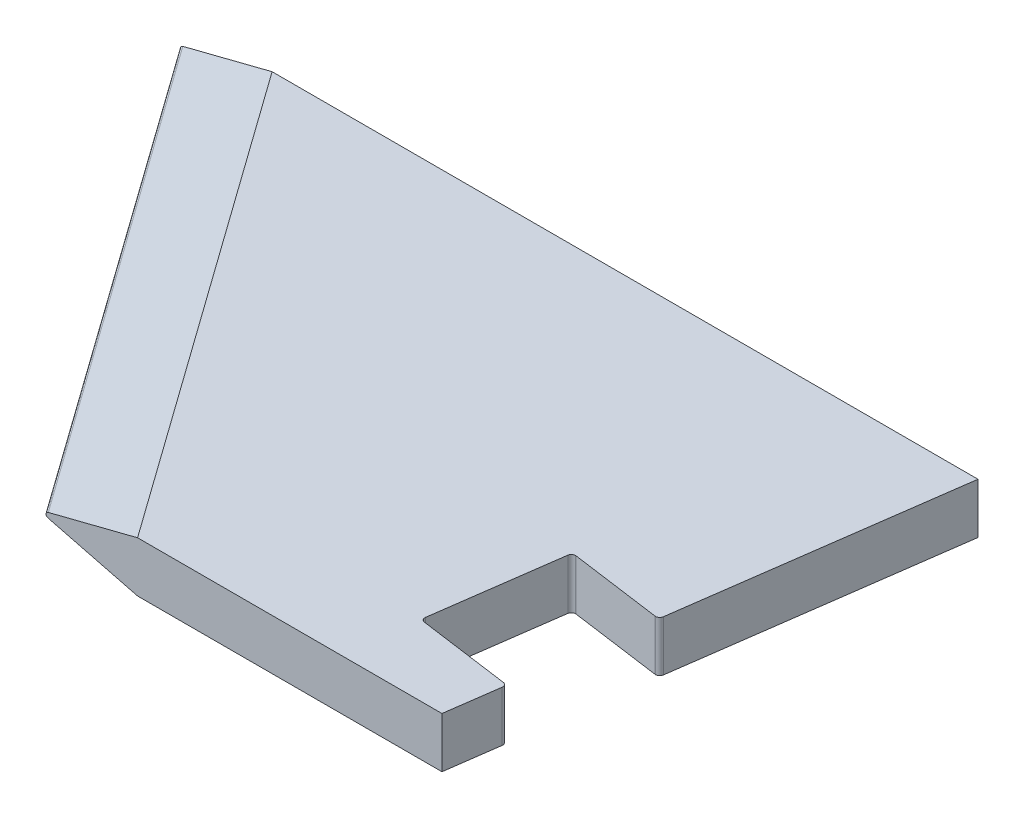
ISO-10303-21;
HEADER;
FILE_DESCRIPTION(('STEP AP214'),'2;1');
FILE_NAME('part.step','',(''),(''),'','','');
FILE_SCHEMA(('AUTOMOTIVE_DESIGN { 1 0 10303 214 1 1 1 1 }'));
ENDSEC;
DATA;
#1=APPLICATION_CONTEXT('core data for automotive mechanical design processes');
#2=APPLICATION_PROTOCOL_DEFINITION('international standard','automotive_design',2000,#1);
#3=PRODUCT_CONTEXT('',#1,'mechanical');
#4=PRODUCT('Part','Part','',(#3));
#5=PRODUCT_RELATED_PRODUCT_CATEGORY('part','',(#4));
#6=PRODUCT_DEFINITION_FORMATION('','',#4);
#7=PRODUCT_DEFINITION_CONTEXT('part definition',#1,'design');
#8=PRODUCT_DEFINITION('design','',#6,#7);
#9=PRODUCT_DEFINITION_SHAPE('','',#8);
#10=(LENGTH_UNIT() NAMED_UNIT(*) SI_UNIT(.MILLI.,.METRE.));
#11=(NAMED_UNIT(*) PLANE_ANGLE_UNIT() SI_UNIT($,.RADIAN.));
#12=(NAMED_UNIT(*) SI_UNIT($,.STERADIAN.) SOLID_ANGLE_UNIT());
#13=UNCERTAINTY_MEASURE_WITH_UNIT(LENGTH_MEASURE(1.E-05),#10,'distance_accuracy_value','');
#14=(GEOMETRIC_REPRESENTATION_CONTEXT(3) GLOBAL_UNCERTAINTY_ASSIGNED_CONTEXT((#13)) GLOBAL_UNIT_ASSIGNED_CONTEXT((#10,
#11,#12)) REPRESENTATION_CONTEXT('',''));
#15=CARTESIAN_POINT('',(0.,0.,0.));
#16=DIRECTION('',(0.,0.,1.));
#17=DIRECTION('',(1.,0.,0.));
#18=AXIS2_PLACEMENT_3D('',#15,#16,#17);
#19=CARTESIAN_POINT('',(697.080108245627,902.081959288103,1397.19559885597));
#20=DIRECTION('',(-0.581238193719095,0.,-0.813733471206736));
#21=DIRECTION('',(-0.813733471206736,0.,0.581238193719095));
#22=AXIS2_PLACEMENT_3D('',#19,#20,#21);
#23=CYLINDRICAL_SURFACE('',#22,0.5);
#24=DIRECTION('',(-0.581238193719096,0.,-0.813733471206735));
#25=VECTOR('',#24,1.);
#26=CARTESIAN_POINT('',(696.673241510024,902.081959288103,1397.48621795283));
#27=LINE('',#26,#25);
#28=CARTESIAN_POINT('',(673.591711678881,902.081959288103,1365.17207618923));
#29=VERTEX_POINT('',#28);
#30=CARTESIAN_POINT('',(610.091711678881,902.081959288103,1276.27207618923));
#31=VERTEX_POINT('',#30);
#32=EDGE_CURVE('E193',#29,#31,#27,.T.);
#33=ORIENTED_EDGE('',*,*,#32,.F.);
#34=CARTESIAN_POINT('',(674.022944700737,902.559213724768,1365.17207618923));
#35=CARTESIAN_POINT('',(673.756851287091,902.491571403177,1365.17207618923));
#36=CARTESIAN_POINT('',(673.591711678881,902.308808009158,1365.17207618923));
#37=CARTESIAN_POINT('',(673.591711678881,902.081959288103,1365.17207618923));
#38=(BOUNDED_CURVE() B_SPLINE_CURVE(3,(#34,#35,#36,#37),.UNSPECIFIED.,.F.,
.F.) B_SPLINE_CURVE_WITH_KNOTS((4,4),(5.01517695905536,6.28318530717959),
.UNSPECIFIED.) CURVE() GEOMETRIC_REPRESENTATION_ITEM() RATIONAL_B_SPLINE_CURVE((1.,
0.870441332498661,0.870441332498661,1.)) REPRESENTATION_ITEM(''));
#39=CARTESIAN_POINT('',(674.022944700737,902.559213724768,1365.17207618923));
#40=VERTEX_POINT('',#39);
#41=EDGE_CURVE('E179',#40,#29,#38,.T.);
#42=ORIENTED_EDGE('',*,*,#41,.F.);
#43=DIRECTION('',(0.581238193719096,0.,0.813733471206735));
#44=VECTOR('',#43,1.);
#45=CARTESIAN_POINT('',(703.288134579254,902.559213724768,1406.14334201915));
#46=LINE('',#45,#44);
#47=CARTESIAN_POINT('',(610.522944700737,902.559213724768,1276.27207618923));
#48=VERTEX_POINT('',#47);
#49=EDGE_CURVE('E377',#48,#40,#46,.T.);
#50=ORIENTED_EDGE('',*,*,#49,.F.);
#51=CARTESIAN_POINT('',(610.091711678881,902.081959288103,1276.27207618923));
#52=CARTESIAN_POINT('',(610.091711678882,902.308808009158,1276.27207618923));
#53=CARTESIAN_POINT('',(610.256851287091,902.491571403177,1276.27207618923));
#54=CARTESIAN_POINT('',(610.522944700737,902.559213724768,1276.27207618923));
#55=(BOUNDED_CURVE() B_SPLINE_CURVE(3,(#51,#52,#53,#54),.UNSPECIFIED.,.F.,
.F.) B_SPLINE_CURVE_WITH_KNOTS((4,4),(0.,1.26800834812425),
.UNSPECIFIED.) CURVE() GEOMETRIC_REPRESENTATION_ITEM() RATIONAL_B_SPLINE_CURVE((1.,
0.870441332498655,0.870441332498655,1.)) REPRESENTATION_ITEM(''));
#56=EDGE_CURVE('E195',#31,#48,#55,.T.);
#57=ORIENTED_EDGE('',*,*,#56,.F.);
#58=EDGE_LOOP('',(#33,#42,#50,#57));
#59=FACE_BOUND('',#58,.T.);
#60=ADVANCED_FACE('F16',(#59),#23,.T.);
#61=CARTESIAN_POINT('',(731.860891026281,897.319459288103,1351.11037783537));
#62=DIRECTION('',(0.,-1.,0.));
#63=DIRECTION('',(0.,0.,-1.));
#64=AXIS2_PLACEMENT_3D('',#61,#62,#63);
#65=CYLINDRICAL_SURFACE('',#64,0.79375);
#66=CARTESIAN_POINT('',(731.860891026281,897.319459288103,1351.11037783537));
#67=DIRECTION('',(0.,1.,0.));
#68=DIRECTION('',(0.,0.,1.));
#69=AXIS2_PLACEMENT_3D('',#66,#67,#68);
#70=CIRCLE('',#69,0.79375);
#71=CARTESIAN_POINT('',(731.074630982272,897.319459288103,1351.00159269992));
#72=VERTEX_POINT('',#71);
#73=CARTESIAN_POINT('',(731.752105890833,897.319459288103,1351.89663787938));
#74=VERTEX_POINT('',#73);
#75=EDGE_CURVE('E366',#72,#74,#70,.T.);
#76=ORIENTED_EDGE('',*,*,#75,.F.);
#77=DIRECTION('',(0.,-1.,0.));
#78=VECTOR('',#77,1.);
#79=CARTESIAN_POINT('',(731.074630982272,897.319459288103,1351.00159269992));
#80=LINE('',#79,#78);
#81=CARTESIAN_POINT('',(731.074630982272,906.844459288103,1351.00159269992));
#82=VERTEX_POINT('',#81);
#83=EDGE_CURVE('E10',#82,#72,#80,.T.);
#84=ORIENTED_EDGE('',*,*,#83,.F.);
#85=CARTESIAN_POINT('',(731.860891026281,906.844459288103,1351.11037783537));
#86=DIRECTION('',(0.,-1.,0.));
#87=DIRECTION('',(0.,0.,1.));
#88=AXIS2_PLACEMENT_3D('',#85,#86,#87);
#89=CIRCLE('',#88,0.79375);
#90=CARTESIAN_POINT('',(731.752105890833,906.844459288103,1351.89663787938));
#91=VERTEX_POINT('',#90);
#92=EDGE_CURVE('E280',#91,#82,#89,.T.);
#93=ORIENTED_EDGE('',*,*,#92,.F.);
#94=DIRECTION('',(0.,1.,0.));
#95=VECTOR('',#94,1.);
#96=CARTESIAN_POINT('',(731.752105890833,906.844459288103,1351.89663787938));
#97=LINE('',#96,#95);
#98=EDGE_CURVE('E48',#74,#91,#97,.T.);
#99=ORIENTED_EDGE('',*,*,#98,.F.);
#100=EDGE_LOOP('',(#76,#84,#93,#99));
#101=FACE_BOUND('',#100,.T.);
#102=ADVANCED_FACE('F398',(#101),#65,.F.);
#103=CARTESIAN_POINT('',(748.941041723591,906.844459288103,1355.07617090324));
#104=DIRECTION('',(0.,1.,0.));
#105=DIRECTION('',(0.,0.,1.));
#106=AXIS2_PLACEMENT_3D('',#103,#104,#105);
#107=CYLINDRICAL_SURFACE('',#106,0.79375);
#108=CARTESIAN_POINT('',(748.941041723591,897.319459288103,1355.07617090324));
#109=DIRECTION('',(0.,-1.,0.));
#110=DIRECTION('',(0.,0.,1.));
#111=AXIS2_PLACEMENT_3D('',#108,#109,#110);
#112=CIRCLE('',#111,0.79375);
#113=CARTESIAN_POINT('',(749.049826859039,897.319459288103,1354.28991085924));
#114=VERTEX_POINT('',#113);
#115=CARTESIAN_POINT('',(749.7273017676,897.319459288103,1355.18495603869));
#116=VERTEX_POINT('',#115);
#117=EDGE_CURVE('E371',#114,#116,#112,.T.);
#118=ORIENTED_EDGE('',*,*,#117,.F.);
#119=DIRECTION('',(0.,-1.,0.));
#120=VECTOR('',#119,1.);
#121=CARTESIAN_POINT('',(749.049826859039,897.319459288103,1354.28991085924));
#122=LINE('',#121,#120);
#123=CARTESIAN_POINT('',(749.049826859039,906.844459288103,1354.28991085924));
#124=VERTEX_POINT('',#123);
#125=EDGE_CURVE('E37',#124,#114,#122,.T.);
#126=ORIENTED_EDGE('',*,*,#125,.F.);
#127=CARTESIAN_POINT('',(748.941041723591,906.844459288103,1355.07617090324));
#128=DIRECTION('',(0.,1.,0.));
#129=DIRECTION('',(0.,0.,1.));
#130=AXIS2_PLACEMENT_3D('',#127,#128,#129);
#131=CIRCLE('',#130,0.79375);
#132=CARTESIAN_POINT('',(749.7273017676,906.844459288103,1355.18495603869));
#133=VERTEX_POINT('',#132);
#134=EDGE_CURVE('E236',#133,#124,#131,.T.);
#135=ORIENTED_EDGE('',*,*,#134,.F.);
#136=DIRECTION('',(0.,1.,0.));
#137=VECTOR('',#136,1.);
#138=CARTESIAN_POINT('',(749.7273017676,906.844459288103,1355.18495603869));
#139=LINE('',#138,#137);
#140=EDGE_CURVE('E246',#116,#133,#139,.T.);
#141=ORIENTED_EDGE('',*,*,#140,.F.);
#142=EDGE_LOOP('',(#118,#126,#135,#141));
#143=FACE_BOUND('',#142,.T.);
#144=ADVANCED_FACE('F439',(#143),#107,.T.);
#145=CARTESIAN_POINT('',(752.639736328818,897.319459288103,1328.34332940693));
#146=DIRECTION('',(0.,1.,0.));
#147=DIRECTION('',(0.,0.,1.));
#148=AXIS2_PLACEMENT_3D('',#145,#146,#147);
#149=CYLINDRICAL_SURFACE('',#148,0.79375);
#150=DIRECTION('',(0.,1.,0.));
#151=VECTOR('',#150,1.);
#152=CARTESIAN_POINT('',(752.639736328818,897.319459288103,1329.13707940693));
#153=LINE('',#152,#151);
#154=CARTESIAN_POINT('',(752.639736328818,897.319459288103,1329.13707940693));
#155=VERTEX_POINT('',#154);
#156=CARTESIAN_POINT('',(752.639736328818,906.844459288103,1329.13707940693));
#157=VERTEX_POINT('',#156);
#158=EDGE_CURVE('E245',#155,#157,#153,.T.);
#159=ORIENTED_EDGE('',*,*,#158,.F.);
#160=CARTESIAN_POINT('',(752.639736328818,897.319459288103,1328.34332940693));
#161=DIRECTION('',(0.,-1.,0.));
#162=DIRECTION('',(0.,0.,1.));
#163=AXIS2_PLACEMENT_3D('',#160,#161,#162);
#164=CIRCLE('',#163,0.79375);
#165=CARTESIAN_POINT('',(753.425996372828,897.319459288103,1328.45211454237));
#166=VERTEX_POINT('',#165);
#167=EDGE_CURVE('E352',#166,#155,#164,.T.);
#168=ORIENTED_EDGE('',*,*,#167,.F.);
#169=DIRECTION('',(0.,-1.,0.));
#170=VECTOR('',#169,1.);
#171=CARTESIAN_POINT('',(753.425996372828,906.844459288103,1328.45211454237));
#172=LINE('',#171,#170);
#173=CARTESIAN_POINT('',(753.425996372828,906.844459288103,1328.45211454237));
#174=VERTEX_POINT('',#173);
#175=EDGE_CURVE('E329',#174,#166,#172,.T.);
#176=ORIENTED_EDGE('',*,*,#175,.F.);
#177=CARTESIAN_POINT('',(752.639736328818,906.844459288103,1328.34332940693));
#178=DIRECTION('',(0.,1.,0.));
#179=DIRECTION('',(0.,0.,1.));
#180=AXIS2_PLACEMENT_3D('',#177,#178,#179);
#181=CIRCLE('',#180,0.79375);
#182=EDGE_CURVE('E339',#157,#174,#181,.T.);
#183=ORIENTED_EDGE('',*,*,#182,.F.);
#184=EDGE_LOOP('',(#159,#168,#176,#183));
#185=FACE_BOUND('',#184,.T.);
#186=ADVANCED_FACE('F418',(#185),#149,.T.);
#187=CARTESIAN_POINT('',(735.124445089717,897.319459288103,1327.52257651509));
#188=DIRECTION('',(0.,-1.,0.));
#189=DIRECTION('',(0.,0.,-1.));
#190=AXIS2_PLACEMENT_3D('',#187,#188,#189);
#191=CYLINDRICAL_SURFACE('',#190,0.79375);
#192=DIRECTION('',(0.,-1.,0.));
#193=VECTOR('',#192,1.);
#194=CARTESIAN_POINT('',(735.124445089717,897.319459288103,1326.72882651509));
#195=LINE('',#194,#193);
#196=CARTESIAN_POINT('',(735.124445089717,906.844459288103,1326.72882651509));
#197=VERTEX_POINT('',#196);
#198=CARTESIAN_POINT('',(735.124445089717,897.319459288103,1326.72882651509));
#199=VERTEX_POINT('',#198);
#200=EDGE_CURVE('E267',#197,#199,#195,.T.);
#201=ORIENTED_EDGE('',*,*,#200,.F.);
#202=CARTESIAN_POINT('',(735.124445089717,906.844459288103,1327.52257651509));
#203=DIRECTION('',(0.,-1.,0.));
#204=DIRECTION('',(0.,0.,1.));
#205=AXIS2_PLACEMENT_3D('',#202,#203,#204);
#206=CIRCLE('',#205,0.79375);
#207=CARTESIAN_POINT('',(734.338185045708,906.844459288103,1327.41379137964));
#208=VERTEX_POINT('',#207);
#209=EDGE_CURVE('E349',#208,#197,#206,.T.);
#210=ORIENTED_EDGE('',*,*,#209,.F.);
#211=DIRECTION('',(0.,1.,0.));
#212=VECTOR('',#211,1.);
#213=CARTESIAN_POINT('',(734.338185045708,906.844459288103,1327.41379137964));
#214=LINE('',#213,#212);
#215=CARTESIAN_POINT('',(734.338185045708,897.319459288103,1327.41379137964));
#216=VERTEX_POINT('',#215);
#217=EDGE_CURVE('E24',#216,#208,#214,.T.);
#218=ORIENTED_EDGE('',*,*,#217,.F.);
#219=CARTESIAN_POINT('',(735.124445089717,897.319459288103,1327.52257651509));
#220=DIRECTION('',(0.,1.,0.));
#221=DIRECTION('',(0.,0.,1.));
#222=AXIS2_PLACEMENT_3D('',#219,#220,#221);
#223=CIRCLE('',#222,0.79375);
#224=EDGE_CURVE('E358',#199,#216,#223,.T.);
#225=ORIENTED_EDGE('',*,*,#224,.F.);
#226=EDGE_LOOP('',(#201,#210,#218,#225));
#227=FACE_BOUND('',#226,.T.);
#228=ADVANCED_FACE('F393',(#227),#191,.F.);
#229=CARTESIAN_POINT('',(734.446970181155,897.319459288103,1326.62753133563));
#230=DIRECTION('',(0.137052139146914,0.,-0.990563834972414));
#231=DIRECTION('',(0.,-1.,0.));
#232=AXIS2_PLACEMENT_3D('',#229,#230,#231);
#233=PLANE('',#232);
#234=DIRECTION('',(-0.990563834972414,0.,-0.137052139146914));
#235=VECTOR('',#234,1.);
#236=CARTESIAN_POINT('',(734.446970181155,906.844459288103,1326.62753133563));
#237=LINE('',#236,#235);
#238=CARTESIAN_POINT('',(752.53095119337,906.844459288103,1329.12958945094));
#239=VERTEX_POINT('',#238);
#240=CARTESIAN_POINT('',(735.233230225165,906.844459288103,1326.73631647108));
#241=VERTEX_POINT('',#240);
#242=EDGE_CURVE('E336',#239,#241,#237,.T.);
#243=ORIENTED_EDGE('',*,*,#242,.T.);
#244=DIRECTION('',(0.,-1.,0.));
#245=VECTOR('',#244,1.);
#246=CARTESIAN_POINT('',(735.233230225165,897.319459288103,1326.73631647108));
#247=LINE('',#246,#245);
#248=CARTESIAN_POINT('',(735.233230225165,897.319459288103,1326.73631647108));
#249=VERTEX_POINT('',#248);
#250=EDGE_CURVE('E263',#241,#249,#247,.T.);
#251=ORIENTED_EDGE('',*,*,#250,.T.);
#252=DIRECTION('',(-0.990563834972414,0.,-0.137052139146914));
#253=VECTOR('',#252,1.);
#254=CARTESIAN_POINT('',(734.446970181155,897.319459288103,1326.62753133563));
#255=LINE('',#254,#253);
#256=CARTESIAN_POINT('',(752.53095119337,897.319459288103,1329.12958945094));
#257=VERTEX_POINT('',#256);
#258=EDGE_CURVE('E355',#257,#249,#255,.T.);
#259=ORIENTED_EDGE('',*,*,#258,.F.);
#260=DIRECTION('',(0.,1.,0.));
#261=VECTOR('',#260,1.);
#262=CARTESIAN_POINT('',(752.53095119337,897.319459288103,1329.12958945094));
#263=LINE('',#262,#261);
#264=EDGE_CURVE('E255',#257,#239,#263,.T.);
#265=ORIENTED_EDGE('',*,*,#264,.T.);
#266=EDGE_LOOP('',(#243,#251,#259,#265));
#267=FACE_BOUND('',#266,.T.);
#268=ADVANCED_FACE('F412',(#267),#233,.F.);
#269=CARTESIAN_POINT('',(734.446970181155,897.319459288103,1326.62753133563));
#270=DIRECTION('',(-0.990563834972414,0.,-0.137052139146914));
#271=DIRECTION('',(-0.137052139146914,0.,0.990563834972414));
#272=AXIS2_PLACEMENT_3D('',#269,#270,#271);
#273=PLANE('',#272);
#274=DIRECTION('',(-0.137052139146914,0.,0.990563834972414));
#275=VECTOR('',#274,1.);
#276=CARTESIAN_POINT('',(734.446970181155,897.319459288103,1326.62753133563));
#277=LINE('',#276,#275);
#278=EDGE_CURVE('E362',#216,#72,#277,.T.);
#279=ORIENTED_EDGE('',*,*,#278,.F.);
#280=ORIENTED_EDGE('',*,*,#217,.T.);
#281=DIRECTION('',(-0.137052139146914,0.,0.990563834972414));
#282=VECTOR('',#281,1.);
#283=CARTESIAN_POINT('',(734.446970181155,906.844459288103,1326.62753133563));
#284=LINE('',#283,#282);
#285=EDGE_CURVE('E284',#208,#82,#284,.T.);
#286=ORIENTED_EDGE('',*,*,#285,.T.);
#287=ORIENTED_EDGE('',*,*,#83,.T.);
#288=EDGE_LOOP('',(#279,#280,#286,#287));
#289=FACE_BOUND('',#288,.T.);
#290=ADVANCED_FACE('F389',(#289),#273,.F.);
#291=CARTESIAN_POINT('',(749.836086903048,897.319459288103,1354.39869599468));
#292=DIRECTION('',(-0.137052139146913,0.,0.990563834972414));
#293=DIRECTION('',(0.,1.,0.));
#294=AXIS2_PLACEMENT_3D('',#291,#292,#293);
#295=PLANE('',#294);
#296=DIRECTION('',(0.990563834972414,0.,0.137052139146913));
#297=VECTOR('',#296,1.);
#298=CARTESIAN_POINT('',(749.836086903048,906.844459288103,1354.39869599468));
#299=LINE('',#298,#297);
#300=EDGE_CURVE('E240',#91,#124,#299,.T.);
#301=ORIENTED_EDGE('',*,*,#300,.T.);
#302=ORIENTED_EDGE('',*,*,#125,.T.);
#303=DIRECTION('',(0.990563834972414,0.,0.137052139146913));
#304=VECTOR('',#303,1.);
#305=CARTESIAN_POINT('',(749.836086903048,897.319459288103,1354.39869599468));
#306=LINE('',#305,#304);
#307=EDGE_CURVE('E367',#74,#114,#306,.T.);
#308=ORIENTED_EDGE('',*,*,#307,.F.);
#309=ORIENTED_EDGE('',*,*,#98,.T.);
#310=EDGE_LOOP('',(#301,#302,#308,#309));
#311=FACE_BOUND('',#310,.T.);
#312=ADVANCED_FACE('F440',(#311),#295,.F.);
#313=CARTESIAN_POINT('',(702.044966200608,902.081959288103,1407.03131943247));
#314=DIRECTION('',(0.242641090911698,-0.954508873330725,-0.173315064936927));
#315=DIRECTION('',(0.,0.178653936378025,-0.983911973205244));
#316=AXIS2_PLACEMENT_3D('',#313,#314,#315);
#317=PLANE('',#316);
#318=DIRECTION('',(-0.96917596398806,-0.246369541193338,0.));
#319=VECTOR('',#318,1.);
#320=CARTESIAN_POINT('',(608.645506741149,902.081959288103,1276.27207618923));
#321=LINE('',#320,#319);
#322=CARTESIAN_POINT('',(627.380373503233,906.844459288103,1276.27207618923));
#323=VERTEX_POINT('',#322);
#324=EDGE_CURVE('E292',#323,#48,#321,.T.);
#325=ORIENTED_EDGE('',*,*,#324,.T.);
#326=ORIENTED_EDGE('',*,*,#49,.T.);
#327=DIRECTION('',(0.96917596398806,0.246369541193338,0.));
#328=VECTOR('',#327,1.);
#329=CARTESIAN_POINT('',(700.230130280559,909.221215804041,1365.17207618923));
#330=LINE('',#329,#328);
#331=CARTESIAN_POINT('',(690.880373503233,906.844459288103,1365.17207618923));
#332=VERTEX_POINT('',#331);
#333=EDGE_CURVE('E187',#40,#332,#330,.T.);
#334=ORIENTED_EDGE('',*,*,#333,.T.);
#335=DIRECTION('',(-0.581238193719096,0.,-0.813733471206735));
#336=VECTOR('',#335,1.);
#337=CARTESIAN_POINT('',(720.779832962693,906.844459288103,1407.03131943247));
#338=LINE('',#337,#336);
#339=EDGE_CURVE('E241',#332,#323,#338,.T.);
#340=ORIENTED_EDGE('',*,*,#339,.T.);
#341=EDGE_LOOP('',(#325,#326,#334,#340));
#342=FACE_BOUND('',#341,.T.);
#343=ADVANCED_FACE('F430',(#342),#317,.F.);
#344=CARTESIAN_POINT('',(695.715619321525,902.081959288103,1398.17023380175));
#345=DIRECTION('',(0.242641090911699,0.954508873330725,-0.173315064936927));
#346=DIRECTION('',(-0.581238193719096,0.,-0.813733471206735));
#347=AXIS2_PLACEMENT_3D('',#344,#345,#346);
#348=PLANE('',#347);
#349=DIRECTION('',(-0.969175963988059,0.246369541193338,0.));
#350=VECTOR('',#349,1.);
#351=CARTESIAN_POINT('',(694.284961787116,896.453995342835,1365.17207618923));
#352=LINE('',#351,#350);
#353=CARTESIAN_POINT('',(690.880373503233,897.319459288103,1365.17207618923));
#354=VERTEX_POINT('',#353);
#355=CARTESIAN_POINT('',(674.022944700737,901.604704851438,1365.17207618923));
#356=VERTEX_POINT('',#355);
#357=EDGE_CURVE('E190',#354,#356,#352,.T.);
#358=ORIENTED_EDGE('',*,*,#357,.T.);
#359=DIRECTION('',(-0.581238193719096,0.,-0.813733471206735));
#360=VECTOR('',#359,1.);
#361=CARTESIAN_POINT('',(696.958787700172,901.604704851438,1397.28225638844));
#362=LINE('',#361,#360);
#363=CARTESIAN_POINT('',(610.522944700737,901.604704851438,1276.27207618923));
#364=VERTEX_POINT('',#363);
#365=EDGE_CURVE('E205',#356,#364,#362,.T.);
#366=ORIENTED_EDGE('',*,*,#365,.T.);
#367=DIRECTION('',(0.969175963988059,-0.246369541193338,0.));
#368=VECTOR('',#367,1.);
#369=CARTESIAN_POINT('',(608.645506741149,902.081959288103,1276.27207618923));
#370=LINE('',#369,#368);
#371=CARTESIAN_POINT('',(627.380373503233,897.319459288103,1276.27207618923));
#372=VERTEX_POINT('',#371);
#373=EDGE_CURVE('E231',#364,#372,#370,.T.);
#374=ORIENTED_EDGE('',*,*,#373,.T.);
#375=DIRECTION('',(-0.581238193719096,0.,-0.813733471206735));
#376=VECTOR('',#375,1.);
#377=CARTESIAN_POINT('',(714.45048608361,897.319459288103,1398.17023380175));
#378=LINE('',#377,#376);
#379=EDGE_CURVE('E374',#354,#372,#378,.T.);
#380=ORIENTED_EDGE('',*,*,#379,.F.);
#381=EDGE_LOOP('',(#358,#366,#374,#380));
#382=FACE_BOUND('',#381,.T.);
#383=ADVANCED_FACE('F442',(#382),#348,.F.);
#384=CARTESIAN_POINT('',(652.844470530374,897.319459288103,1398.77568628284));
#385=DIRECTION('',(0.,1.,0.));
#386=DIRECTION('',(1.,0.,0.));
#387=AXIS2_PLACEMENT_3D('',#384,#385,#386);
#388=PLANE('',#387);
#389=DIRECTION('',(0.137052139146914,0.,-0.990563834972414));
#390=VECTOR('',#389,1.);
#391=CARTESIAN_POINT('',(748.345506741148,897.319459288103,1365.17207618923));
#392=LINE('',#391,#390);
#393=CARTESIAN_POINT('',(760.645506741148,897.319459288103,1276.27207618923));
#394=VERTEX_POINT('',#393);
#395=EDGE_CURVE('E333',#166,#394,#392,.T.);
#396=ORIENTED_EDGE('',*,*,#395,.F.);
#397=ORIENTED_EDGE('',*,*,#167,.T.);
#398=CARTESIAN_POINT('',(752.639736328818,897.319459288103,1328.34332940693));
#399=DIRECTION('',(0.,-1.,0.));
#400=DIRECTION('',(0.,0.,1.));
#401=AXIS2_PLACEMENT_3D('',#398,#399,#400);
#402=CIRCLE('',#401,0.79375);
#403=EDGE_CURVE('E235',#155,#257,#402,.T.);
#404=ORIENTED_EDGE('',*,*,#403,.T.);
#405=ORIENTED_EDGE('',*,*,#258,.T.);
#406=CARTESIAN_POINT('',(735.124445089717,897.319459288103,1327.52257651509));
#407=DIRECTION('',(0.,1.,0.));
#408=DIRECTION('',(0.,0.,1.));
#409=AXIS2_PLACEMENT_3D('',#406,#407,#408);
#410=CIRCLE('',#409,0.79375);
#411=EDGE_CURVE('E216',#249,#199,#410,.T.);
#412=ORIENTED_EDGE('',*,*,#411,.T.);
#413=ORIENTED_EDGE('',*,*,#224,.T.);
#414=ORIENTED_EDGE('',*,*,#278,.T.);
#415=ORIENTED_EDGE('',*,*,#75,.T.);
#416=ORIENTED_EDGE('',*,*,#307,.T.);
#417=ORIENTED_EDGE('',*,*,#117,.T.);
#418=DIRECTION('',(0.137052139146914,0.,-0.990563834972414));
#419=VECTOR('',#418,1.);
#420=CARTESIAN_POINT('',(748.345506741148,897.319459288103,1365.17207618923));
#421=LINE('',#420,#419);
#422=CARTESIAN_POINT('',(748.345506741148,897.319459288103,1365.17207618923));
#423=VERTEX_POINT('',#422);
#424=EDGE_CURVE('E250',#423,#116,#421,.T.);
#425=ORIENTED_EDGE('',*,*,#424,.F.);
#426=DIRECTION('',(1.,0.,0.));
#427=VECTOR('',#426,1.);
#428=CARTESIAN_POINT('',(672.145506741148,897.319459288103,1365.17207618923));
#429=LINE('',#428,#427);
#430=EDGE_CURVE('E320',#354,#423,#429,.T.);
#431=ORIENTED_EDGE('',*,*,#430,.F.);
#432=ORIENTED_EDGE('',*,*,#379,.T.);
#433=DIRECTION('',(-1.,0.,0.));
#434=VECTOR('',#433,1.);
#435=CARTESIAN_POINT('',(608.645506741149,897.319459288103,1276.27207618923));
#436=LINE('',#435,#434);
#437=EDGE_CURVE('E307',#394,#372,#436,.T.);
#438=ORIENTED_EDGE('',*,*,#437,.F.);
#439=EDGE_LOOP('',(#396,#397,#404,#405,#412,#413,#414,#415,#416,#417,#425,#431,#432,#438));
#440=FACE_BOUND('',#439,.T.);
#441=ADVANCED_FACE('F403',(#440),#388,.F.);
#442=CARTESIAN_POINT('',(652.844470530374,906.844459288103,1398.77568628284));
#443=DIRECTION('',(0.,1.,0.));
#444=DIRECTION('',(1.,0.,0.));
#445=AXIS2_PLACEMENT_3D('',#442,#443,#444);
#446=PLANE('',#445);
#447=ORIENTED_EDGE('',*,*,#242,.F.);
#448=CARTESIAN_POINT('',(752.639736328818,906.844459288103,1328.34332940693));
#449=DIRECTION('',(0.,1.,0.));
#450=DIRECTION('',(0.,0.,1.));
#451=AXIS2_PLACEMENT_3D('',#448,#449,#450);
#452=CIRCLE('',#451,0.79375);
#453=EDGE_CURVE('E251',#239,#157,#452,.T.);
#454=ORIENTED_EDGE('',*,*,#453,.T.);
#455=ORIENTED_EDGE('',*,*,#182,.T.);
#456=DIRECTION('',(0.137052139146914,0.,-0.990563834972414));
#457=VECTOR('',#456,1.);
#458=CARTESIAN_POINT('',(748.345506741148,906.844459288103,1365.17207618923));
#459=LINE('',#458,#457);
#460=CARTESIAN_POINT('',(760.645506741148,906.844459288103,1276.27207618923));
#461=VERTEX_POINT('',#460);
#462=EDGE_CURVE('E326',#174,#461,#459,.T.);
#463=ORIENTED_EDGE('',*,*,#462,.T.);
#464=DIRECTION('',(-1.,0.,0.));
#465=VECTOR('',#464,1.);
#466=CARTESIAN_POINT('',(608.645506741149,906.844459288103,1276.27207618923));
#467=LINE('',#466,#465);
#468=EDGE_CURVE('E299',#461,#323,#467,.T.);
#469=ORIENTED_EDGE('',*,*,#468,.T.);
#470=ORIENTED_EDGE('',*,*,#339,.F.);
#471=DIRECTION('',(1.,0.,0.));
#472=VECTOR('',#471,1.);
#473=CARTESIAN_POINT('',(672.145506741148,906.844459288103,1365.17207618923));
#474=LINE('',#473,#472);
#475=CARTESIAN_POINT('',(748.345506741148,906.844459288103,1365.17207618923));
#476=VERTEX_POINT('',#475);
#477=EDGE_CURVE('E323',#332,#476,#474,.T.);
#478=ORIENTED_EDGE('',*,*,#477,.T.);
#479=DIRECTION('',(0.137052139146914,0.,-0.990563834972414));
#480=VECTOR('',#479,1.);
#481=CARTESIAN_POINT('',(748.345506741148,906.844459288103,1365.17207618923));
#482=LINE('',#481,#480);
#483=EDGE_CURVE('E232',#476,#133,#482,.T.);
#484=ORIENTED_EDGE('',*,*,#483,.T.);
#485=ORIENTED_EDGE('',*,*,#134,.T.);
#486=ORIENTED_EDGE('',*,*,#300,.F.);
#487=ORIENTED_EDGE('',*,*,#92,.T.);
#488=ORIENTED_EDGE('',*,*,#285,.F.);
#489=ORIENTED_EDGE('',*,*,#209,.T.);
#490=CARTESIAN_POINT('',(735.124445089717,906.844459288103,1327.52257651509));
#491=DIRECTION('',(0.,-1.,0.));
#492=DIRECTION('',(0.,0.,1.));
#493=AXIS2_PLACEMENT_3D('',#490,#491,#492);
#494=CIRCLE('',#493,0.79375);
#495=EDGE_CURVE('E262',#197,#241,#494,.T.);
#496=ORIENTED_EDGE('',*,*,#495,.T.);
#497=EDGE_LOOP('',(#447,#454,#455,#463,#469,#470,#478,#484,#485,#486,#487,#488,#489,#496));
#498=FACE_BOUND('',#497,.T.);
#499=ADVANCED_FACE('F396',(#498),#446,.T.);
#500=CARTESIAN_POINT('',(748.345506741148,906.844459288103,1365.17207618923));
#501=DIRECTION('',(-0.990563834972414,0.,-0.137052139146914));
#502=DIRECTION('',(-0.137052139146914,0.,0.990563834972414));
#503=AXIS2_PLACEMENT_3D('',#500,#501,#502);
#504=PLANE('',#503);
#505=ORIENTED_EDGE('',*,*,#462,.F.);
#506=ORIENTED_EDGE('',*,*,#175,.T.);
#507=ORIENTED_EDGE('',*,*,#395,.T.);
#508=DIRECTION('',(0.,-1.,0.));
#509=VECTOR('',#508,1.);
#510=CARTESIAN_POINT('',(760.645506741148,906.844459288103,1276.27207618923));
#511=LINE('',#510,#509);
#512=EDGE_CURVE('E303',#461,#394,#511,.T.);
#513=ORIENTED_EDGE('',*,*,#512,.F.);
#514=EDGE_LOOP('',(#505,#506,#507,#513));
#515=FACE_BOUND('',#514,.T.);
#516=ADVANCED_FACE('F425',(#515),#504,.F.);
#517=CARTESIAN_POINT('',(672.145506741148,906.844459288103,1365.17207618923));
#518=DIRECTION('',(0.,0.,-1.));
#519=DIRECTION('',(0.,-1.,0.));
#520=AXIS2_PLACEMENT_3D('',#517,#518,#519);
#521=PLANE('',#520);
#522=ORIENTED_EDGE('',*,*,#333,.F.);
#523=ORIENTED_EDGE('',*,*,#41,.T.);
#524=CARTESIAN_POINT('',(673.591711678881,902.081959288103,1365.17207618923));
#525=CARTESIAN_POINT('',(673.591711678881,901.855110567048,1365.17207618923));
#526=CARTESIAN_POINT('',(673.756851287091,901.672347173029,1365.17207618923));
#527=CARTESIAN_POINT('',(674.022944700737,901.604704851438,1365.17207618923));
#528=(BOUNDED_CURVE() B_SPLINE_CURVE(3,(#524,#525,#526,#527),.UNSPECIFIED.,.F.,
.F.) B_SPLINE_CURVE_WITH_KNOTS((4,4),(0.,1.26800834812423),
.UNSPECIFIED.) CURVE() GEOMETRIC_REPRESENTATION_ITEM() RATIONAL_B_SPLINE_CURVE((1.,
0.870441332498659,0.870441332498659,1.)) REPRESENTATION_ITEM(''));
#529=EDGE_CURVE('E184',#29,#356,#528,.T.);
#530=ORIENTED_EDGE('',*,*,#529,.T.);
#531=ORIENTED_EDGE('',*,*,#357,.F.);
#532=ORIENTED_EDGE('',*,*,#430,.T.);
#533=DIRECTION('',(0.,-1.,0.));
#534=VECTOR('',#533,1.);
#535=CARTESIAN_POINT('',(748.345506741148,906.844459288103,1365.17207618923));
#536=LINE('',#535,#534);
#537=EDGE_CURVE('E227',#476,#423,#536,.T.);
#538=ORIENTED_EDGE('',*,*,#537,.F.);
#539=ORIENTED_EDGE('',*,*,#477,.F.);
#540=EDGE_LOOP('',(#522,#523,#530,#531,#532,#538,#539));
#541=FACE_BOUND('',#540,.T.);
#542=ADVANCED_FACE('F181',(#541),#521,.F.);
#543=CARTESIAN_POINT('',(608.645506741149,906.844459288103,1276.27207618923));
#544=DIRECTION('',(0.,0.,1.));
#545=DIRECTION('',(1.,0.,0.));
#546=AXIS2_PLACEMENT_3D('',#543,#544,#545);
#547=PLANE('',#546);
#548=ORIENTED_EDGE('',*,*,#373,.F.);
#549=CARTESIAN_POINT('',(610.522944700737,901.604704851438,1276.27207618923));
#550=CARTESIAN_POINT('',(610.256851287091,901.672347173029,1276.27207618923));
#551=CARTESIAN_POINT('',(610.091711678881,901.855110567048,1276.27207618923));
#552=CARTESIAN_POINT('',(610.091711678881,902.081959288103,1276.27207618923));
#553=(BOUNDED_CURVE() B_SPLINE_CURVE(3,(#549,#550,#551,#552),.UNSPECIFIED.,.F.,
.F.) B_SPLINE_CURVE_WITH_KNOTS((4,4),(5.01517695905532,6.28318530717959),
.UNSPECIFIED.) CURVE() GEOMETRIC_REPRESENTATION_ITEM() RATIONAL_B_SPLINE_CURVE((1.,
0.870441332498653,0.870441332498653,1.)) REPRESENTATION_ITEM(''));
#554=EDGE_CURVE('E200',#364,#31,#553,.T.);
#555=ORIENTED_EDGE('',*,*,#554,.T.);
#556=ORIENTED_EDGE('',*,*,#56,.T.);
#557=ORIENTED_EDGE('',*,*,#324,.F.);
#558=ORIENTED_EDGE('',*,*,#468,.F.);
#559=ORIENTED_EDGE('',*,*,#512,.T.);
#560=ORIENTED_EDGE('',*,*,#437,.T.);
#561=EDGE_LOOP('',(#548,#555,#556,#557,#558,#559,#560));
#562=FACE_BOUND('',#561,.T.);
#563=ADVANCED_FACE('F428',(#562),#547,.F.);
#564=CARTESIAN_POINT('',(748.345506741148,906.844459288103,1365.17207618923));
#565=DIRECTION('',(-0.990563834972414,0.,-0.137052139146914));
#566=DIRECTION('',(-0.137052139146914,0.,0.990563834972414));
#567=AXIS2_PLACEMENT_3D('',#564,#565,#566);
#568=PLANE('',#567);
#569=ORIENTED_EDGE('',*,*,#424,.T.);
#570=ORIENTED_EDGE('',*,*,#140,.T.);
#571=ORIENTED_EDGE('',*,*,#483,.F.);
#572=ORIENTED_EDGE('',*,*,#537,.T.);
#573=EDGE_LOOP('',(#569,#570,#571,#572));
#574=FACE_BOUND('',#573,.T.);
#575=ADVANCED_FACE('F436',(#574),#568,.F.);
#576=CARTESIAN_POINT('',(735.124445089717,897.319459288103,1327.52257651509));
#577=DIRECTION('',(0.,-1.,0.));
#578=DIRECTION('',(0.,0.,-1.));
#579=AXIS2_PLACEMENT_3D('',#576,#577,#578);
#580=CYLINDRICAL_SURFACE('',#579,0.79375);
#581=ORIENTED_EDGE('',*,*,#495,.F.);
#582=ORIENTED_EDGE('',*,*,#200,.T.);
#583=ORIENTED_EDGE('',*,*,#411,.F.);
#584=ORIENTED_EDGE('',*,*,#250,.F.);
#585=EDGE_LOOP('',(#581,#582,#583,#584));
#586=FACE_BOUND('',#585,.T.);
#587=ADVANCED_FACE('F408',(#586),#580,.F.);
#588=CARTESIAN_POINT('',(752.639736328818,897.319459288103,1328.34332940693));
#589=DIRECTION('',(0.,1.,0.));
#590=DIRECTION('',(0.,0.,1.));
#591=AXIS2_PLACEMENT_3D('',#588,#589,#590);
#592=CYLINDRICAL_SURFACE('',#591,0.79375);
#593=ORIENTED_EDGE('',*,*,#403,.F.);
#594=ORIENTED_EDGE('',*,*,#158,.T.);
#595=ORIENTED_EDGE('',*,*,#453,.F.);
#596=ORIENTED_EDGE('',*,*,#264,.F.);
#597=EDGE_LOOP('',(#593,#594,#595,#596));
#598=FACE_BOUND('',#597,.T.);
#599=ADVANCED_FACE('F415',(#598),#592,.T.);
#600=CARTESIAN_POINT('',(697.080108245627,902.081959288103,1397.19559885597));
#601=DIRECTION('',(-0.581238193719095,0.,-0.813733471206736));
#602=DIRECTION('',(-0.813733471206736,0.,0.581238193719095));
#603=AXIS2_PLACEMENT_3D('',#600,#601,#602);
#604=CYLINDRICAL_SURFACE('',#603,0.5);
#605=ORIENTED_EDGE('',*,*,#529,.F.);
#606=ORIENTED_EDGE('',*,*,#32,.T.);
#607=ORIENTED_EDGE('',*,*,#554,.F.);
#608=ORIENTED_EDGE('',*,*,#365,.F.);
#609=EDGE_LOOP('',(#605,#606,#607,#608));
#610=FACE_BOUND('',#609,.T.);
#611=ADVANCED_FACE('F203',(#610),#604,.T.);
#612=CLOSED_SHELL('',(#60,#102,#144,#186,#228,#268,#290,#312,#343,#383,#441,#499,#516,#542,#563,
#575,#587,#599,#611));
#613=MANIFOLD_SOLID_BREP('B1',#612);
#614=ADVANCED_BREP_SHAPE_REPRESENTATION('',(#18,#613),#14);
#615=SHAPE_DEFINITION_REPRESENTATION(#9,#614);
ENDSEC;
END-ISO-10303-21;
